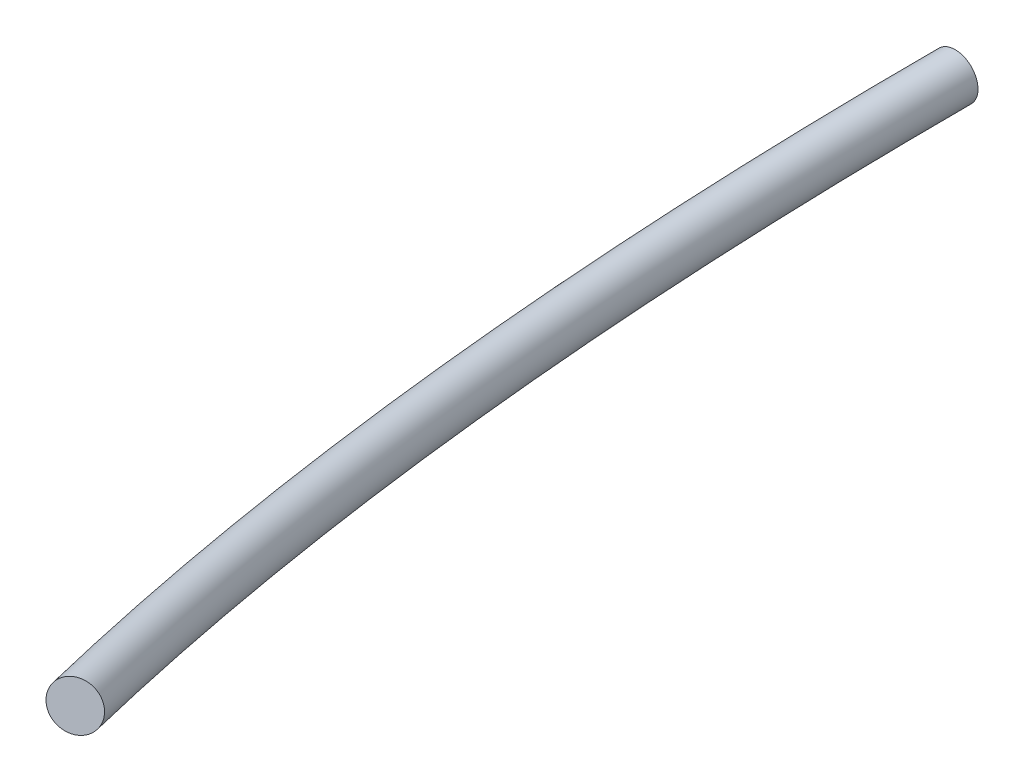
ISO-10303-21;
HEADER;
FILE_DESCRIPTION(('STEP AP214'),'2;1');
FILE_NAME('part.step','',(''),(''),'','','');
FILE_SCHEMA(('AUTOMOTIVE_DESIGN { 1 0 10303 214 1 1 1 1 }'));
ENDSEC;
DATA;
#1=APPLICATION_CONTEXT('core data for automotive mechanical design processes');
#2=APPLICATION_PROTOCOL_DEFINITION('international standard','automotive_design',2000,#1);
#3=PRODUCT_CONTEXT('',#1,'mechanical');
#4=PRODUCT('Part','Part','',(#3));
#5=PRODUCT_RELATED_PRODUCT_CATEGORY('part','',(#4));
#6=PRODUCT_DEFINITION_FORMATION('','',#4);
#7=PRODUCT_DEFINITION_CONTEXT('part definition',#1,'design');
#8=PRODUCT_DEFINITION('design','',#6,#7);
#9=PRODUCT_DEFINITION_SHAPE('','',#8);
#10=(LENGTH_UNIT() NAMED_UNIT(*) SI_UNIT(.MILLI.,.METRE.));
#11=(NAMED_UNIT(*) PLANE_ANGLE_UNIT() SI_UNIT($,.RADIAN.));
#12=(NAMED_UNIT(*) SI_UNIT($,.STERADIAN.) SOLID_ANGLE_UNIT());
#13=UNCERTAINTY_MEASURE_WITH_UNIT(LENGTH_MEASURE(1.E-05),#10,'distance_accuracy_value','');
#14=(GEOMETRIC_REPRESENTATION_CONTEXT(3) GLOBAL_UNCERTAINTY_ASSIGNED_CONTEXT((#13)) GLOBAL_UNIT_ASSIGNED_CONTEXT((#10,
#11,#12)) REPRESENTATION_CONTEXT('',''));
#15=CARTESIAN_POINT('',(0.,0.,0.));
#16=DIRECTION('',(0.,0.,1.));
#17=DIRECTION('',(1.,0.,0.));
#18=AXIS2_PLACEMENT_3D('',#15,#16,#17);
#19=CARTESIAN_POINT('',(6589.10880521123,-8861.85131498619,-1.33226762955019E-11));
#20=DIRECTION('',(0.402002092697015,-0.915638748343047,0.));
#21=DIRECTION('',(0.915638748343047,0.402002092697015,0.));
#22=AXIS2_PLACEMENT_3D('',#19,#20,#21);
#23=TOROIDAL_SURFACE('',#22,6415.11779499183,50.8000000000002);
#24=CARTESIAN_POINT('',(1134.41991098,-11256.6782644357,2380.10698771333));
#25=DIRECTION('',(0.339716004101083,0.14914893544909,0.928626745044529));
#26=DIRECTION('',(0.940161068626194,-0.0262716881308882,-0.339716004101083));
#27=AXIS2_PLACEMENT_3D('',#24,#25,#26);
#28=CIRCLE('',#27,50.8000000000002);
#29=CARTESIAN_POINT('',(1091.22535015007,-11275.6424070937,2398.95456601817));
#30=VERTEX_POINT('',#29);
#31=EDGE_CURVE('E10',#30,#30,#28,.T.);
#32=CARTESIAN_POINT('',(715.178376931702,-11440.7420934708,4.44089209850063E-13));
#33=DIRECTION('',(0.,0.,1.));
#34=DIRECTION('',(1.,0.,0.));
#35=AXIS2_PLACEMENT_3D('',#32,#33,#34);
#36=CIRCLE('',#35,50.8000000000002);
#37=CARTESIAN_POINT('',(668.663928515874,-11461.1637997798,5.53105397864234E-13));
#38=VERTEX_POINT('',#37);
#39=EDGE_CURVE('E41',#38,#38,#36,.T.);
#40=CARTESIAN_POINT('',(6589.10880521123,-8861.85131498619,-1.33226762955019E-11));
#41=DIRECTION('',(0.402002092697015,-0.915638748343047,0.));
#42=DIRECTION('',(0.915638748343047,0.402002092697015,0.));
#43=AXIS2_PLACEMENT_3D('',#40,#41,#42);
#44=CIRCLE('',#43,6465.91779499183);
#45=EDGE_CURVE('',#30,#38,#44,.T.);
#46=ORIENTED_EDGE('',*,*,#31,.F.);
#47=ORIENTED_EDGE('',*,*,#39,.T.);
#48=ORIENTED_EDGE('',*,*,#45,.T.);
#49=ORIENTED_EDGE('',*,*,#45,.F.);
#50=EDGE_LOOP('',(#46,#48,#47,#49));
#51=FACE_BOUND('',#50,.T.);
#52=ADVANCED_FACE('F35',(#51),#23,.T.);
#53=CARTESIAN_POINT('',(1134.41991098,-11256.6782644357,2380.10698771333));
#54=DIRECTION('',(0.339716004101083,0.14914893544909,0.928626745044529));
#55=DIRECTION('',(0.940161068626194,-0.0262716881308882,-0.339716004101083));
#56=AXIS2_PLACEMENT_3D('',#53,#54,#55);
#57=PLANE('',#56);
#58=ORIENTED_EDGE('',*,*,#31,.T.);
#59=EDGE_LOOP('',(#58));
#60=FACE_BOUND('',#59,.T.);
#61=ADVANCED_FACE('F50',(#60),#57,.T.);
#62=CARTESIAN_POINT('',(715.178376931702,-11440.7420934708,4.44089209850063E-13));
#63=DIRECTION('',(0.,0.,1.));
#64=DIRECTION('',(1.,0.,0.));
#65=AXIS2_PLACEMENT_3D('',#62,#63,#64);
#66=PLANE('',#65);
#67=ORIENTED_EDGE('',*,*,#39,.F.);
#68=EDGE_LOOP('',(#67));
#69=FACE_BOUND('',#68,.T.);
#70=ADVANCED_FACE('F48',(#69),#66,.F.);
#71=CLOSED_SHELL('',(#52,#61,#70));
#72=MANIFOLD_SOLID_BREP('B2',#71);
#73=ADVANCED_BREP_SHAPE_REPRESENTATION('',(#18,#72),#14);
#74=SHAPE_DEFINITION_REPRESENTATION(#9,#73);
ENDSEC;
END-ISO-10303-21;
